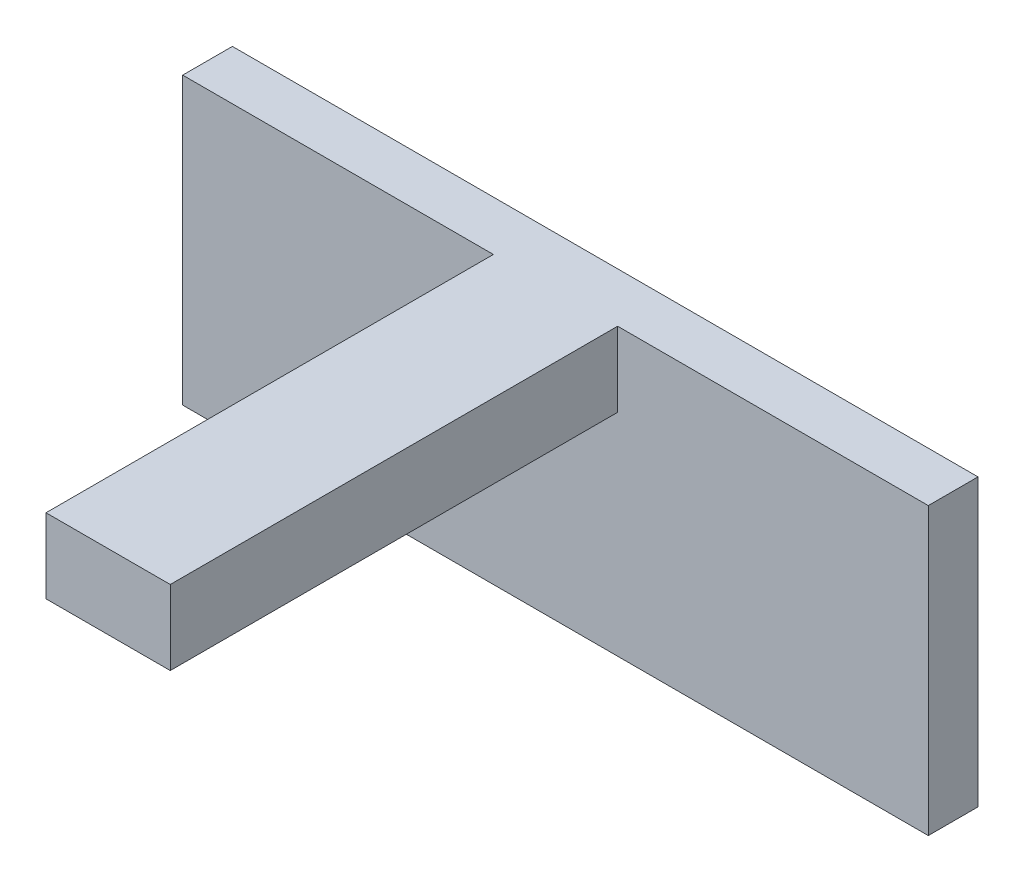
ISO-10303-21;
HEADER;
FILE_DESCRIPTION(('STEP AP214'),'2;1');
FILE_NAME('part.step','',(''),(''),'','','');
FILE_SCHEMA(('AUTOMOTIVE_DESIGN { 1 0 10303 214 1 1 1 1 }'));
ENDSEC;
DATA;
#1=APPLICATION_CONTEXT('core data for automotive mechanical design processes');
#2=APPLICATION_PROTOCOL_DEFINITION('international standard','automotive_design',2000,#1);
#3=PRODUCT_CONTEXT('',#1,'mechanical');
#4=PRODUCT('Part','Part','',(#3));
#5=PRODUCT_RELATED_PRODUCT_CATEGORY('part','',(#4));
#6=PRODUCT_DEFINITION_FORMATION('','',#4);
#7=PRODUCT_DEFINITION_CONTEXT('part definition',#1,'design');
#8=PRODUCT_DEFINITION('design','',#6,#7);
#9=PRODUCT_DEFINITION_SHAPE('','',#8);
#10=(LENGTH_UNIT() NAMED_UNIT(*) SI_UNIT(.MILLI.,.METRE.));
#11=(NAMED_UNIT(*) PLANE_ANGLE_UNIT() SI_UNIT($,.RADIAN.));
#12=(NAMED_UNIT(*) SI_UNIT($,.STERADIAN.) SOLID_ANGLE_UNIT());
#13=UNCERTAINTY_MEASURE_WITH_UNIT(LENGTH_MEASURE(1.E-05),#10,'distance_accuracy_value','');
#14=(GEOMETRIC_REPRESENTATION_CONTEXT(3) GLOBAL_UNCERTAINTY_ASSIGNED_CONTEXT((#13)) GLOBAL_UNIT_ASSIGNED_CONTEXT((#10,
#11,#12)) REPRESENTATION_CONTEXT('',''));
#15=CARTESIAN_POINT('',(0.,0.,0.));
#16=DIRECTION('',(0.,0.,1.));
#17=DIRECTION('',(1.,0.,0.));
#18=AXIS2_PLACEMENT_3D('',#15,#16,#17);
#19=CARTESIAN_POINT('',(0.,0.,10.));
#20=DIRECTION('',(0.,0.,-1.));
#21=DIRECTION('',(-1.,0.,0.));
#22=AXIS2_PLACEMENT_3D('',#19,#20,#21);
#23=PLANE('',#22);
#24=DIRECTION('',(0.,1.,0.));
#25=VECTOR('',#24,1.);
#26=CARTESIAN_POINT('',(12.5,17.5,10.));
#27=LINE('',#26,#25);
#28=CARTESIAN_POINT('',(12.5,17.5,10.));
#29=VERTEX_POINT('',#28);
#30=CARTESIAN_POINT('',(12.5,32.5,10.));
#31=VERTEX_POINT('',#30);
#32=EDGE_CURVE('E58',#29,#31,#27,.T.);
#33=ORIENTED_EDGE('',*,*,#32,.F.);
#34=DIRECTION('',(1.,0.,0.));
#35=VECTOR('',#34,1.);
#36=CARTESIAN_POINT('',(-12.5,17.5,10.));
#37=LINE('',#36,#35);
#38=CARTESIAN_POINT('',(-12.5,17.5,10.));
#39=VERTEX_POINT('',#38);
#40=EDGE_CURVE('E132',#39,#29,#37,.T.);
#41=ORIENTED_EDGE('',*,*,#40,.F.);
#42=DIRECTION('',(0.,-1.,0.));
#43=VECTOR('',#42,1.);
#44=CARTESIAN_POINT('',(-12.5,17.5,10.));
#45=LINE('',#44,#43);
#46=CARTESIAN_POINT('',(-12.5,32.5,10.));
#47=VERTEX_POINT('',#46);
#48=EDGE_CURVE('E12',#47,#39,#45,.T.);
#49=ORIENTED_EDGE('',*,*,#48,.F.);
#50=DIRECTION('',(-1.,0.,0.));
#51=VECTOR('',#50,1.);
#52=CARTESIAN_POINT('',(-75.,32.5,10.));
#53=LINE('',#52,#51);
#54=CARTESIAN_POINT('',(-75.,32.5,10.));
#55=VERTEX_POINT('',#54);
#56=EDGE_CURVE('E224',#47,#55,#53,.T.);
#57=ORIENTED_EDGE('',*,*,#56,.T.);
#58=DIRECTION('',(0.,-1.,0.));
#59=VECTOR('',#58,1.);
#60=CARTESIAN_POINT('',(-75.,-25.,10.));
#61=LINE('',#60,#59);
#62=CARTESIAN_POINT('',(-75.,-25.,10.));
#63=VERTEX_POINT('',#62);
#64=EDGE_CURVE('E115',#55,#63,#61,.T.);
#65=ORIENTED_EDGE('',*,*,#64,.T.);
#66=DIRECTION('',(1.,0.,0.));
#67=VECTOR('',#66,1.);
#68=CARTESIAN_POINT('',(-75.,-25.,10.));
#69=LINE('',#68,#67);
#70=CARTESIAN_POINT('',(75.,-25.,10.));
#71=VERTEX_POINT('',#70);
#72=EDGE_CURVE('E66',#63,#71,#69,.T.);
#73=ORIENTED_EDGE('',*,*,#72,.T.);
#74=DIRECTION('',(0.,1.,0.));
#75=VECTOR('',#74,1.);
#76=CARTESIAN_POINT('',(75.,-25.,10.));
#77=LINE('',#76,#75);
#78=CARTESIAN_POINT('',(75.,32.5,10.));
#79=VERTEX_POINT('',#78);
#80=EDGE_CURVE('E89',#71,#79,#77,.T.);
#81=ORIENTED_EDGE('',*,*,#80,.T.);
#82=EDGE_CURVE('E244',#79,#31,#53,.T.);
#83=ORIENTED_EDGE('',*,*,#82,.T.);
#84=EDGE_LOOP('',(#33,#41,#49,#57,#65,#73,#81,#83));
#85=FACE_BOUND('',#84,.T.);
#86=ADVANCED_FACE('F41',(#85),#23,.F.);
#87=CARTESIAN_POINT('',(75.,-25.,10.));
#88=DIRECTION('',(-1.,0.,0.));
#89=DIRECTION('',(0.,0.,1.));
#90=AXIS2_PLACEMENT_3D('',#87,#88,#89);
#91=PLANE('',#90);
#92=DIRECTION('',(0.,1.,0.));
#93=VECTOR('',#92,1.);
#94=CARTESIAN_POINT('',(75.,-25.,0.));
#95=LINE('',#94,#93);
#96=CARTESIAN_POINT('',(75.,-25.,0.));
#97=VERTEX_POINT('',#96);
#98=CARTESIAN_POINT('',(75.,32.5,0.));
#99=VERTEX_POINT('',#98);
#100=EDGE_CURVE('E96',#97,#99,#95,.T.);
#101=ORIENTED_EDGE('',*,*,#100,.T.);
#102=DIRECTION('',(0.,0.,1.));
#103=VECTOR('',#102,1.);
#104=CARTESIAN_POINT('',(75.,32.5,0.));
#105=LINE('',#104,#103);
#106=EDGE_CURVE('E220',#99,#79,#105,.T.);
#107=ORIENTED_EDGE('',*,*,#106,.T.);
#108=ORIENTED_EDGE('',*,*,#80,.F.);
#109=DIRECTION('',(0.,0.,-1.));
#110=VECTOR('',#109,1.);
#111=CARTESIAN_POINT('',(75.,-25.,10.));
#112=LINE('',#111,#110);
#113=EDGE_CURVE('E82',#71,#97,#112,.T.);
#114=ORIENTED_EDGE('',*,*,#113,.T.);
#115=EDGE_LOOP('',(#101,#107,#108,#114));
#116=FACE_BOUND('',#115,.T.);
#117=ADVANCED_FACE('F43',(#116),#91,.F.);
#118=CARTESIAN_POINT('',(-75.,-25.,10.));
#119=DIRECTION('',(1.,0.,0.));
#120=DIRECTION('',(0.,0.,-1.));
#121=AXIS2_PLACEMENT_3D('',#118,#119,#120);
#122=PLANE('',#121);
#123=DIRECTION('',(0.,-1.,0.));
#124=VECTOR('',#123,1.);
#125=CARTESIAN_POINT('',(-75.,-25.,0.));
#126=LINE('',#125,#124);
#127=CARTESIAN_POINT('',(-75.,32.5,0.));
#128=VERTEX_POINT('',#127);
#129=CARTESIAN_POINT('',(-75.,-25.,0.));
#130=VERTEX_POINT('',#129);
#131=EDGE_CURVE('E90',#128,#130,#126,.T.);
#132=ORIENTED_EDGE('',*,*,#131,.T.);
#133=DIRECTION('',(0.,0.,-1.));
#134=VECTOR('',#133,1.);
#135=CARTESIAN_POINT('',(-75.,-25.,10.));
#136=LINE('',#135,#134);
#137=EDGE_CURVE('E45',#63,#130,#136,.T.);
#138=ORIENTED_EDGE('',*,*,#137,.F.);
#139=ORIENTED_EDGE('',*,*,#64,.F.);
#140=DIRECTION('',(0.,0.,-1.));
#141=VECTOR('',#140,1.);
#142=CARTESIAN_POINT('',(-75.,32.5,0.));
#143=LINE('',#142,#141);
#144=EDGE_CURVE('E214',#55,#128,#143,.T.);
#145=ORIENTED_EDGE('',*,*,#144,.T.);
#146=EDGE_LOOP('',(#132,#138,#139,#145));
#147=FACE_BOUND('',#146,.T.);
#148=ADVANCED_FACE('F204',(#147),#122,.F.);
#149=CARTESIAN_POINT('',(-75.,-25.,10.));
#150=DIRECTION('',(0.,1.,0.));
#151=DIRECTION('',(0.,0.,1.));
#152=AXIS2_PLACEMENT_3D('',#149,#150,#151);
#153=PLANE('',#152);
#154=DIRECTION('',(1.,0.,0.));
#155=VECTOR('',#154,1.);
#156=CARTESIAN_POINT('',(-75.,-25.,0.));
#157=LINE('',#156,#155);
#158=EDGE_CURVE('E79',#130,#97,#157,.T.);
#159=ORIENTED_EDGE('',*,*,#158,.T.);
#160=ORIENTED_EDGE('',*,*,#113,.F.);
#161=ORIENTED_EDGE('',*,*,#72,.F.);
#162=ORIENTED_EDGE('',*,*,#137,.T.);
#163=EDGE_LOOP('',(#159,#160,#161,#162));
#164=FACE_BOUND('',#163,.T.);
#165=ADVANCED_FACE('F81',(#164),#153,.F.);
#166=CARTESIAN_POINT('',(0.,0.,0.));
#167=DIRECTION('',(0.,0.,-1.));
#168=DIRECTION('',(-1.,0.,0.));
#169=AXIS2_PLACEMENT_3D('',#166,#167,#168);
#170=PLANE('',#169);
#171=ORIENTED_EDGE('',*,*,#100,.F.);
#172=ORIENTED_EDGE('',*,*,#158,.F.);
#173=ORIENTED_EDGE('',*,*,#131,.F.);
#174=DIRECTION('',(1.,0.,0.));
#175=VECTOR('',#174,1.);
#176=CARTESIAN_POINT('',(-75.,32.5,0.));
#177=LINE('',#176,#175);
#178=EDGE_CURVE('E102',#128,#99,#177,.T.);
#179=ORIENTED_EDGE('',*,*,#178,.T.);
#180=EDGE_LOOP('',(#171,#172,#173,#179));
#181=FACE_BOUND('',#180,.T.);
#182=ADVANCED_FACE('F100',(#181),#170,.T.);
#183=CARTESIAN_POINT('',(12.5,17.5,100.));
#184=DIRECTION('',(-1.,0.,0.));
#185=DIRECTION('',(0.,0.,1.));
#186=AXIS2_PLACEMENT_3D('',#183,#184,#185);
#187=PLANE('',#186);
#188=ORIENTED_EDGE('',*,*,#32,.T.);
#189=DIRECTION('',(0.,0.,-1.));
#190=VECTOR('',#189,1.);
#191=CARTESIAN_POINT('',(12.5,32.5,100.));
#192=LINE('',#191,#190);
#193=CARTESIAN_POINT('',(12.5,32.5,100.));
#194=VERTEX_POINT('',#193);
#195=EDGE_CURVE('E104',#194,#31,#192,.T.);
#196=ORIENTED_EDGE('',*,*,#195,.F.);
#197=DIRECTION('',(0.,1.,0.));
#198=VECTOR('',#197,1.);
#199=CARTESIAN_POINT('',(12.5,17.5,100.));
#200=LINE('',#199,#198);
#201=CARTESIAN_POINT('',(12.5,17.5,100.));
#202=VERTEX_POINT('',#201);
#203=EDGE_CURVE('E134',#202,#194,#200,.T.);
#204=ORIENTED_EDGE('',*,*,#203,.F.);
#205=DIRECTION('',(0.,0.,-1.));
#206=VECTOR('',#205,1.);
#207=CARTESIAN_POINT('',(12.5,17.5,100.));
#208=LINE('',#207,#206);
#209=EDGE_CURVE('E127',#202,#29,#208,.T.);
#210=ORIENTED_EDGE('',*,*,#209,.T.);
#211=EDGE_LOOP('',(#188,#196,#204,#210));
#212=FACE_BOUND('',#211,.T.);
#213=ADVANCED_FACE('F194',(#212),#187,.F.);
#214=CARTESIAN_POINT('',(-12.5,32.5,100.));
#215=DIRECTION('',(0.,-1.,0.));
#216=DIRECTION('',(0.,0.,-1.));
#217=AXIS2_PLACEMENT_3D('',#214,#215,#216);
#218=PLANE('',#217);
#219=ORIENTED_EDGE('',*,*,#195,.T.);
#220=ORIENTED_EDGE('',*,*,#82,.F.);
#221=ORIENTED_EDGE('',*,*,#106,.F.);
#222=ORIENTED_EDGE('',*,*,#178,.F.);
#223=ORIENTED_EDGE('',*,*,#144,.F.);
#224=ORIENTED_EDGE('',*,*,#56,.F.);
#225=DIRECTION('',(0.,0.,-1.));
#226=VECTOR('',#225,1.);
#227=CARTESIAN_POINT('',(-12.5,32.5,100.));
#228=LINE('',#227,#226);
#229=CARTESIAN_POINT('',(-12.5,32.5,100.));
#230=VERTEX_POINT('',#229);
#231=EDGE_CURVE('E110',#230,#47,#228,.T.);
#232=ORIENTED_EDGE('',*,*,#231,.F.);
#233=DIRECTION('',(-1.,0.,0.));
#234=VECTOR('',#233,1.);
#235=CARTESIAN_POINT('',(-12.5,32.5,100.));
#236=LINE('',#235,#234);
#237=EDGE_CURVE('E146',#194,#230,#236,.T.);
#238=ORIENTED_EDGE('',*,*,#237,.F.);
#239=EDGE_LOOP('',(#219,#220,#221,#222,#223,#224,#232,#238));
#240=FACE_BOUND('',#239,.T.);
#241=ADVANCED_FACE('F190',(#240),#218,.F.);
#242=CARTESIAN_POINT('',(-12.5,17.5,100.));
#243=DIRECTION('',(1.,0.,0.));
#244=DIRECTION('',(0.,0.,-1.));
#245=AXIS2_PLACEMENT_3D('',#242,#243,#244);
#246=PLANE('',#245);
#247=ORIENTED_EDGE('',*,*,#231,.T.);
#248=ORIENTED_EDGE('',*,*,#48,.T.);
#249=DIRECTION('',(0.,0.,-1.));
#250=VECTOR('',#249,1.);
#251=CARTESIAN_POINT('',(-12.5,17.5,100.));
#252=LINE('',#251,#250);
#253=CARTESIAN_POINT('',(-12.5,17.5,100.));
#254=VERTEX_POINT('',#253);
#255=EDGE_CURVE('E123',#254,#39,#252,.T.);
#256=ORIENTED_EDGE('',*,*,#255,.F.);
#257=DIRECTION('',(0.,-1.,0.));
#258=VECTOR('',#257,1.);
#259=CARTESIAN_POINT('',(-12.5,17.5,100.));
#260=LINE('',#259,#258);
#261=EDGE_CURVE('E142',#230,#254,#260,.T.);
#262=ORIENTED_EDGE('',*,*,#261,.F.);
#263=EDGE_LOOP('',(#247,#248,#256,#262));
#264=FACE_BOUND('',#263,.T.);
#265=ADVANCED_FACE('F186',(#264),#246,.F.);
#266=CARTESIAN_POINT('',(-12.5,17.5,100.));
#267=DIRECTION('',(0.,1.,0.));
#268=DIRECTION('',(0.,0.,1.));
#269=AXIS2_PLACEMENT_3D('',#266,#267,#268);
#270=PLANE('',#269);
#271=CARTESIAN_POINT('',(0.,17.5,90.));
#272=DIRECTION('',(0.,-1.,0.));
#273=DIRECTION('',(0.,0.,-1.));
#274=AXIS2_PLACEMENT_3D('',#271,#272,#273);
#275=CIRCLE('',#274,6.);
#276=CARTESIAN_POINT('',(-3.43768322203029,17.5,85.0824463332902));
#277=VERTEX_POINT('',#276);
#278=EDGE_CURVE('E158',#277,#277,#275,.T.);
#279=ORIENTED_EDGE('',*,*,#278,.F.);
#280=EDGE_LOOP('',(#279));
#281=FACE_BOUND('',#280,.T.);
#282=ORIENTED_EDGE('',*,*,#40,.T.);
#283=ORIENTED_EDGE('',*,*,#209,.F.);
#284=DIRECTION('',(1.,0.,0.));
#285=VECTOR('',#284,1.);
#286=CARTESIAN_POINT('',(-12.5,17.5,100.));
#287=LINE('',#286,#285);
#288=EDGE_CURVE('E131',#254,#202,#287,.T.);
#289=ORIENTED_EDGE('',*,*,#288,.F.);
#290=ORIENTED_EDGE('',*,*,#255,.T.);
#291=EDGE_LOOP('',(#282,#283,#289,#290));
#292=FACE_BOUND('',#291,.T.);
#293=ADVANCED_FACE('F182',(#281,#292),#270,.F.);
#294=CARTESIAN_POINT('',(0.,0.,100.));
#295=DIRECTION('',(0.,0.,-1.));
#296=DIRECTION('',(-1.,0.,0.));
#297=AXIS2_PLACEMENT_3D('',#294,#295,#296);
#298=PLANE('',#297);
#299=ORIENTED_EDGE('',*,*,#203,.T.);
#300=ORIENTED_EDGE('',*,*,#237,.T.);
#301=ORIENTED_EDGE('',*,*,#261,.T.);
#302=ORIENTED_EDGE('',*,*,#288,.T.);
#303=EDGE_LOOP('',(#299,#300,#301,#302));
#304=FACE_BOUND('',#303,.T.);
#305=ADVANCED_FACE('F175',(#304),#298,.F.);
#306=CARTESIAN_POINT('',(0.,23.5,90.));
#307=DIRECTION('',(0.,-1.,0.));
#308=DIRECTION('',(0.,0.,-1.));
#309=AXIS2_PLACEMENT_3D('',#306,#307,#308);
#310=PLANE('',#309);
#311=CARTESIAN_POINT('',(0.,23.5,90.));
#312=DIRECTION('',(0.,-1.,0.));
#313=DIRECTION('',(0.,0.,-1.));
#314=AXIS2_PLACEMENT_3D('',#311,#312,#313);
#315=CIRCLE('',#314,5.);
#316=CARTESIAN_POINT('',(0.,23.5,85.));
#317=VERTEX_POINT('',#316);
#318=EDGE_CURVE('E138',#317,#317,#315,.T.);
#319=ORIENTED_EDGE('',*,*,#318,.T.);
#320=EDGE_LOOP('',(#319));
#321=FACE_BOUND('',#320,.T.);
#322=ADVANCED_FACE('F164',(#321),#310,.T.);
#323=CARTESIAN_POINT('',(-3.43768322203029,17.5,85.0824463332902));
#324=CARTESIAN_POINT('',(0.,23.5,85.));
#325=CARTESIAN_POINT('',(-13.27279055545,17.5,91.9578127773507));
#326=CARTESIAN_POINT('',(-10.,23.5,85.));
#327=CARTESIAN_POINT('',(-6.3974241113894,17.5,101.79292011077));
#328=CARTESIAN_POINT('',(-10.,23.5,95.));
#329=CARTESIAN_POINT('',(3.43768322203029,17.5,94.9175536667098));
#330=CARTESIAN_POINT('',(0.,23.5,95.));
#331=CARTESIAN_POINT('',(13.27279055545,17.5,88.0421872226493));
#332=CARTESIAN_POINT('',(10.,23.5,95.));
#333=CARTESIAN_POINT('',(6.39742411138941,17.5,78.2070798892296));
#334=CARTESIAN_POINT('',(10.,23.5,85.));
#335=CARTESIAN_POINT('',(-3.43768322203029,17.5,85.0824463332902));
#336=CARTESIAN_POINT('',(0.,23.5,85.));
#337=(BOUNDED_SURFACE() B_SPLINE_SURFACE(3,1,((#323,#324),(#325,#326),(#327,#328),(#329,#330),
(#331,#332),(#333,#334),(#335,#336)),.UNSPECIFIED.,.T.,.F.,.F.) B_SPLINE_SURFACE_WITH_KNOTS((4,
3,4),(2,2),(0.,0.5,1.),(0.,1.),
.UNSPECIFIED.) GEOMETRIC_REPRESENTATION_ITEM() RATIONAL_B_SPLINE_SURFACE(((1.,1.),
(0.333333333333333,0.333333333333333),(0.333333333333333,0.333333333333333),(1.,1.),
(0.333333333333333,0.333333333333333),(0.333333333333333,0.333333333333333),(1.,1.))) REPRESENTATION_ITEM('') SURFACE());
#338=CARTESIAN_POINT('',(-3.43768322203029,17.5,85.0824463332902));
#339=CARTESIAN_POINT('',(-3.40187402180081,17.5625,85.0815875173184));
#340=CARTESIAN_POINT('',(-3.36606482157132,17.625,85.0807287013466));
#341=CARTESIAN_POINT('',(-3.29444642111236,17.75,85.0790110694031));
#342=CARTESIAN_POINT('',(-3.25863722088288,17.8125,85.0781522534313));
#343=CARTESIAN_POINT('',(-3.18701882042391,17.9375,85.0764346214877));
#344=CARTESIAN_POINT('',(-3.15120962019443,18.,85.075575805516));
#345=CARTESIAN_POINT('',(-3.07959121973547,18.125,85.0738581735724));
#346=CARTESIAN_POINT('',(-3.04378201950599,18.1875,85.0729993576006));
#347=CARTESIAN_POINT('',(-2.97216361904702,18.3125,85.0712817256571));
#348=CARTESIAN_POINT('',(-2.93635441881754,18.375,85.0704229096853));
#349=CARTESIAN_POINT('',(-2.86473601835857,18.5,85.0687052777418));
#350=CARTESIAN_POINT('',(-2.82892681812909,18.5625,85.06784646177));
#351=CARTESIAN_POINT('',(-2.75730841767013,18.6875,85.0661288298265));
#352=CARTESIAN_POINT('',(-2.72149921744065,18.75,85.0652700138547));
#353=CARTESIAN_POINT('',(-2.64988081698168,18.875,85.0635523819112));
#354=CARTESIAN_POINT('',(-2.6140716167522,18.9375,85.0626935659394));
#355=CARTESIAN_POINT('',(-2.54245321629323,19.0625,85.0609759339958));
#356=CARTESIAN_POINT('',(-2.50664401606375,19.125,85.0601171180241));
#357=CARTESIAN_POINT('',(-2.43502561560479,19.25,85.0583994860805));
#358=CARTESIAN_POINT('',(-2.39921641537531,19.3125,85.0575406701088));
#359=CARTESIAN_POINT('',(-2.32759801491634,19.4375,85.0558230381652));
#360=CARTESIAN_POINT('',(-2.29178881468686,19.5,85.0549642221934));
#361=CARTESIAN_POINT('',(-2.22017041422789,19.625,85.0532465902499));
#362=CARTESIAN_POINT('',(-2.18436121399841,19.6875,85.0523877742781));
#363=CARTESIAN_POINT('',(-2.11274281353945,19.8125,85.0506701423346));
#364=CARTESIAN_POINT('',(-2.07693361330997,19.875,85.0498113263628));
#365=CARTESIAN_POINT('',(-2.005315212851,20.,85.0480936944193));
#366=CARTESIAN_POINT('',(-1.96950601262152,20.0625,85.0472348784475));
#367=CARTESIAN_POINT('',(-1.89788761216255,20.1875,85.0455172465039));
#368=CARTESIAN_POINT('',(-1.86207841193307,20.25,85.0446584305322));
#369=CARTESIAN_POINT('',(-1.79046001147411,20.375,85.0429407985886));
#370=CARTESIAN_POINT('',(-1.75465081124463,20.4375,85.0420819826168));
#371=CARTESIAN_POINT('',(-1.68303241078566,20.5625,85.0403643506733));
#372=CARTESIAN_POINT('',(-1.64722321055618,20.625,85.0395055347015));
#373=CARTESIAN_POINT('',(-1.57560481009722,20.75,85.037787902758));
#374=CARTESIAN_POINT('',(-1.53979560986773,20.8125,85.0369290867862));
#375=CARTESIAN_POINT('',(-1.46817720940877,20.9375,85.0352114548427));
#376=CARTESIAN_POINT('',(-1.43236800917929,21.,85.0343526388709));
#377=CARTESIAN_POINT('',(-1.36074960872032,21.125,85.0326350069274));
#378=CARTESIAN_POINT('',(-1.32494040849084,21.1875,85.0317761909556));
#379=CARTESIAN_POINT('',(-1.25332200803188,21.3125,85.030058559012));
#380=CARTESIAN_POINT('',(-1.21751280780239,21.375,85.0291997430403));
#381=CARTESIAN_POINT('',(-1.14589440734343,21.5,85.0274821110967));
#382=CARTESIAN_POINT('',(-1.11008520711395,21.5625,85.0266232951249));
#383=CARTESIAN_POINT('',(-1.03846680665498,21.6875,85.0249056631814));
#384=CARTESIAN_POINT('',(-1.0026576064255,21.75,85.0240468472096));
#385=CARTESIAN_POINT('',(-0.931039205966535,21.875,85.0223292152661));
#386=CARTESIAN_POINT('',(-0.895230005737053,21.9375,85.0214703992943));
#387=CARTESIAN_POINT('',(-0.823611605278089,22.0625,85.0197527673508));
#388=CARTESIAN_POINT('',(-0.787802405048607,22.125,85.018893951379));
#389=CARTESIAN_POINT('',(-0.716184004589642,22.25,85.0171763194354));
#390=CARTESIAN_POINT('',(-0.68037480436016,22.3125,85.0163175034637));
#391=CARTESIAN_POINT('',(-0.608756403901196,22.4375,85.0145998715201));
#392=CARTESIAN_POINT('',(-0.572947203671714,22.5,85.0137410555484));
#393=CARTESIAN_POINT('',(-0.501328803212749,22.625,85.0120234236048));
#394=CARTESIAN_POINT('',(-0.465519602983267,22.6875,85.011164607633));
#395=CARTESIAN_POINT('',(-0.393901202524303,22.8125,85.0094469756895));
#396=CARTESIAN_POINT('',(-0.358092002294821,22.875,85.0085881597177));
#397=CARTESIAN_POINT('',(-0.286473601835856,23.,85.0068705277742));
#398=CARTESIAN_POINT('',(-0.250664401606374,23.0625,85.0060117118024));
#399=CARTESIAN_POINT('',(-0.17904600114741,23.1875,85.0042940798589));
#400=CARTESIAN_POINT('',(-0.143236800917928,23.25,85.0034352638871));
#401=CARTESIAN_POINT('',(-0.0716184004589631,23.375,85.0017176319435));
#402=CARTESIAN_POINT('',(-0.0358092002294809,23.4375,85.0008588159718));
#403=CARTESIAN_POINT('',(0.,23.5,85.));
#404=B_SPLINE_CURVE_WITH_KNOTS('',3,(#338,#339,#340,#341,#342,#343,#344,#345,#346,#347,#348,
#349,#350,#351,#352,#353,#354,#355,#356,#357,#358,#359,#360,#361,#362,#363,#364,#365,#366,#367,
#368,#369,#370,#371,#372,#373,#374,#375,#376,#377,#378,#379,#380,#381,#382,#383,#384,#385,#386,
#387,#388,#389,#390,#391,#392,#393,#394,#395,#396,#397,#398,#399,#400,#401,#402,#403),
.UNSPECIFIED.,.F.,.F.,(4,2,2,2,2,2,2,2,2,2,2,2,2,2,2,2,2,2,2,2,2,2,2,2,2,2,2,2,2,2,2,2,4),(0.,
0.216110104977846,0.432220209955697,0.648330314933546,0.864440419911394,1.08055052488924,
1.29666062986709,1.51277073484494,1.72888083982279,1.94499094480064,2.16110104977849,
2.37721115475633,2.59332125973418,2.80943136471203,3.02554146968988,3.24165157466773,
3.45776167964557,3.67387178462342,3.88998188960127,4.10609199457912,4.32220209955697,
4.53831220453481,4.75442230951267,4.97053241449051,5.18664251946836,5.40275262444621,
5.61886272942406,5.83497283440191,6.05108293937975,6.2671930443576,6.48330314933545,
6.6994132543133,6.91552335929115),.UNSPECIFIED.);
#405=EDGE_CURVE('BSEAM174',#277,#317,#404,.T.);
#406=ORIENTED_EDGE('',*,*,#278,.T.);
#407=ORIENTED_EDGE('',*,*,#318,.F.);
#408=ORIENTED_EDGE('',*,*,#405,.T.);
#409=ORIENTED_EDGE('',*,*,#405,.F.);
#410=EDGE_LOOP('',(#406,#408,#407,#409));
#411=FACE_BOUND('',#410,.T.);
#412=ADVANCED_FACE('F174',(#411),#337,.F.);
#413=CLOSED_SHELL('',(#86,#117,#148,#165,#182,#213,#241,#265,#293,#305,#322,#412));
#414=MANIFOLD_SOLID_BREP('B2',#413);
#415=ADVANCED_BREP_SHAPE_REPRESENTATION('',(#18,#414),#14);
#416=SHAPE_DEFINITION_REPRESENTATION(#9,#415);
ENDSEC;
END-ISO-10303-21;
